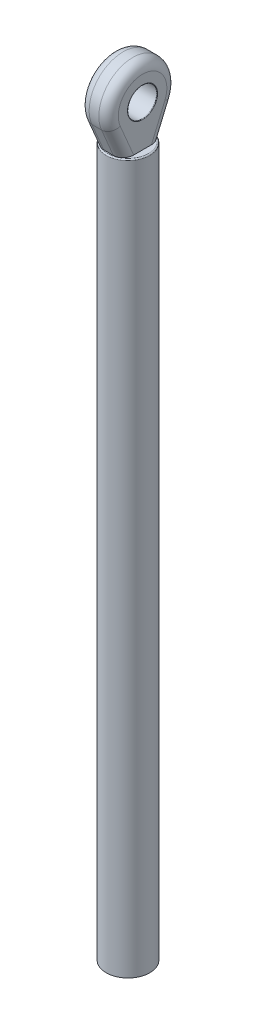
ISO-10303-21;
HEADER;
FILE_DESCRIPTION(('STEP AP214'),'2;1');
FILE_NAME('part.step','',(''),(''),'','','');
FILE_SCHEMA(('AUTOMOTIVE_DESIGN { 1 0 10303 214 1 1 1 1 }'));
ENDSEC;
DATA;
#1=APPLICATION_CONTEXT('core data for automotive mechanical design processes');
#2=APPLICATION_PROTOCOL_DEFINITION('international standard','automotive_design',2000,#1);
#3=PRODUCT_CONTEXT('',#1,'mechanical');
#4=PRODUCT('Part','Part','',(#3));
#5=PRODUCT_RELATED_PRODUCT_CATEGORY('part','',(#4));
#6=PRODUCT_DEFINITION_FORMATION('','',#4);
#7=PRODUCT_DEFINITION_CONTEXT('part definition',#1,'design');
#8=PRODUCT_DEFINITION('design','',#6,#7);
#9=PRODUCT_DEFINITION_SHAPE('','',#8);
#10=(LENGTH_UNIT() NAMED_UNIT(*) SI_UNIT(.MILLI.,.METRE.));
#11=(NAMED_UNIT(*) PLANE_ANGLE_UNIT() SI_UNIT($,.RADIAN.));
#12=(NAMED_UNIT(*) SI_UNIT($,.STERADIAN.) SOLID_ANGLE_UNIT());
#13=UNCERTAINTY_MEASURE_WITH_UNIT(LENGTH_MEASURE(1.E-05),#10,'distance_accuracy_value','');
#14=(GEOMETRIC_REPRESENTATION_CONTEXT(3) GLOBAL_UNCERTAINTY_ASSIGNED_CONTEXT((#13)) GLOBAL_UNIT_ASSIGNED_CONTEXT((#10,
#11,#12)) REPRESENTATION_CONTEXT('',''));
#15=CARTESIAN_POINT('',(0.,0.,0.));
#16=DIRECTION('',(0.,0.,1.));
#17=DIRECTION('',(1.,0.,0.));
#18=AXIS2_PLACEMENT_3D('',#15,#16,#17);
#19=CARTESIAN_POINT('',(0.,0.,0.));
#20=DIRECTION('',(0.,1.,0.));
#21=DIRECTION('',(0.,0.,1.));
#22=AXIS2_PLACEMENT_3D('',#19,#20,#21);
#23=PLANE('',#22);
#24=CARTESIAN_POINT('',(0.,0.,0.));
#25=DIRECTION('',(0.,1.,0.));
#26=DIRECTION('',(0.,0.,1.));
#27=AXIS2_PLACEMENT_3D('',#24,#25,#26);
#28=CIRCLE('',#27,45.);
#29=CARTESIAN_POINT('',(0.,0.,45.));
#30=VERTEX_POINT('',#29);
#31=EDGE_CURVE('E348',#30,#30,#28,.T.);
#32=ORIENTED_EDGE('',*,*,#31,.F.);
#33=EDGE_LOOP('',(#32));
#34=FACE_BOUND('',#33,.T.);
#35=CARTESIAN_POINT('',(0.,0.,0.));
#36=DIRECTION('',(0.,1.,0.));
#37=DIRECTION('',(0.,0.,1.));
#38=AXIS2_PLACEMENT_3D('',#35,#36,#37);
#39=CIRCLE('',#38,22.5);
#40=CARTESIAN_POINT('',(0.,0.,22.5));
#41=VERTEX_POINT('',#40);
#42=EDGE_CURVE('E347',#41,#41,#39,.T.);
#43=ORIENTED_EDGE('',*,*,#42,.T.);
#44=EDGE_LOOP('',(#43));
#45=FACE_BOUND('',#44,.T.);
#46=ADVANCED_FACE('F34',(#34,#45),#23,.F.);
#47=CARTESIAN_POINT('',(0.,1450.,0.));
#48=DIRECTION('',(0.,-1.,0.));
#49=DIRECTION('',(0.,0.,-1.));
#50=AXIS2_PLACEMENT_3D('',#47,#48,#49);
#51=CYLINDRICAL_SURFACE('',#50,45.);
#52=CARTESIAN_POINT('',(0.,1457.5,0.));
#53=DIRECTION('',(0.,-1.,0.));
#54=DIRECTION('',(0.,0.,-1.));
#55=AXIS2_PLACEMENT_3D('',#52,#53,#54);
#56=CIRCLE('',#55,45.);
#57=CARTESIAN_POINT('',(0.,1457.5,-45.));
#58=VERTEX_POINT('',#57);
#59=EDGE_CURVE('E130',#58,#58,#56,.T.);
#60=ORIENTED_EDGE('',*,*,#59,.T.);
#61=EDGE_LOOP('',(#60));
#62=FACE_BOUND('',#61,.T.);
#63=ORIENTED_EDGE('',*,*,#31,.T.);
#64=EDGE_LOOP('',(#63));
#65=FACE_BOUND('',#64,.T.);
#66=ADVANCED_FACE('F163',(#62,#65),#51,.T.);
#67=CARTESIAN_POINT('',(0.,1450.,0.));
#68=DIRECTION('',(0.,-1.,0.));
#69=DIRECTION('',(0.,0.,-1.));
#70=AXIS2_PLACEMENT_3D('',#67,#68,#69);
#71=CYLINDRICAL_SURFACE('',#70,22.5);
#72=CARTESIAN_POINT('',(0.,1450.,0.));
#73=DIRECTION('',(0.,1.,0.));
#74=DIRECTION('',(0.,0.,1.));
#75=AXIS2_PLACEMENT_3D('',#72,#73,#74);
#76=CIRCLE('',#75,22.5);
#77=CARTESIAN_POINT('',(0.,1450.,22.5));
#78=VERTEX_POINT('',#77);
#79=EDGE_CURVE('E344',#78,#78,#76,.T.);
#80=ORIENTED_EDGE('',*,*,#79,.T.);
#81=EDGE_LOOP('',(#80));
#82=FACE_BOUND('',#81,.T.);
#83=ORIENTED_EDGE('',*,*,#42,.F.);
#84=EDGE_LOOP('',(#83));
#85=FACE_BOUND('',#84,.T.);
#86=ADVANCED_FACE('F169',(#82,#85),#71,.F.);
#87=CARTESIAN_POINT('',(0.,1450.,0.));
#88=DIRECTION('',(0.,1.,0.));
#89=DIRECTION('',(0.,0.,1.));
#90=AXIS2_PLACEMENT_3D('',#87,#88,#89);
#91=PLANE('',#90);
#92=ORIENTED_EDGE('',*,*,#79,.F.);
#93=EDGE_LOOP('',(#92));
#94=FACE_BOUND('',#93,.T.);
#95=ADVANCED_FACE('F309',(#94),#91,.F.);
#96=CARTESIAN_POINT('',(-30.,1660.,-75.0000000000001));
#97=DIRECTION('',(1.,0.,0.));
#98=DIRECTION('',(0.,0.,-1.));
#99=AXIS2_PLACEMENT_3D('',#96,#97,#98);
#100=PLANE('',#99);
#101=DIRECTION('',(0.,0.,1.));
#102=VECTOR('',#101,1.);
#103=CARTESIAN_POINT('',(-30.,1460.,-75.0000000000001));
#104=LINE('',#103,#102);
#105=CARTESIAN_POINT('',(-30.,1460.,-18.2775506528153));
#106=VERTEX_POINT('',#105);
#107=CARTESIAN_POINT('',(-30.,1460.,18.2775506528153));
#108=VERTEX_POINT('',#107);
#109=EDGE_CURVE('E110',#106,#108,#104,.T.);
#110=ORIENTED_EDGE('',*,*,#109,.T.);
#111=DIRECTION('',(0.,0.920706485734868,0.390255771418886));
#112=VECTOR('',#111,1.);
#113=CARTESIAN_POINT('',(-30.,1596.02443472153,75.9336240340078));
#114=LINE('',#113,#112);
#115=CARTESIAN_POINT('',(-30.,1525.48721142906,46.0353242867434));
#116=VERTEX_POINT('',#115);
#117=EDGE_CURVE('E116',#108,#116,#114,.T.);
#118=ORIENTED_EDGE('',*,*,#117,.T.);
#119=CARTESIAN_POINT('',(-30.,1545.,0.));
#120=DIRECTION('',(1.,0.,0.));
#121=DIRECTION('',(0.,0.,-1.));
#122=AXIS2_PLACEMENT_3D('',#119,#120,#121);
#123=CIRCLE('',#122,50.);
#124=CARTESIAN_POINT('',(-30.,1525.48721142906,-46.0353242867434));
#125=VERTEX_POINT('',#124);
#126=EDGE_CURVE('E51',#116,#125,#123,.F.);
#127=ORIENTED_EDGE('',*,*,#126,.T.);
#128=DIRECTION('',(0.,-0.920706485734868,0.390255771418886));
#129=VECTOR('',#128,1.);
#130=CARTESIAN_POINT('',(-30.,1649.92108769766,-98.7785591028703));
#131=LINE('',#130,#129);
#132=EDGE_CURVE('E107',#125,#106,#131,.T.);
#133=ORIENTED_EDGE('',*,*,#132,.T.);
#134=EDGE_LOOP('',(#110,#118,#127,#133));
#135=FACE_BOUND('',#134,.T.);
#136=CARTESIAN_POINT('',(-30.,1545.,0.));
#137=DIRECTION('',(1.,0.,0.));
#138=DIRECTION('',(0.,0.,-1.));
#139=AXIS2_PLACEMENT_3D('',#136,#137,#138);
#140=CIRCLE('',#139,30.);
#141=CARTESIAN_POINT('',(-30.,1545.,-30.));
#142=VERTEX_POINT('',#141);
#143=EDGE_CURVE('E142',#142,#142,#140,.T.);
#144=ORIENTED_EDGE('',*,*,#143,.T.);
#145=EDGE_LOOP('',(#144));
#146=FACE_BOUND('',#145,.T.);
#147=ADVANCED_FACE('F108',(#135,#146),#100,.F.);
#148=CARTESIAN_POINT('',(30.,1660.,-75.0000000000001));
#149=DIRECTION('',(-1.,0.,0.));
#150=DIRECTION('',(0.,0.,1.));
#151=AXIS2_PLACEMENT_3D('',#148,#149,#150);
#152=PLANE('',#151);
#153=CARTESIAN_POINT('',(30.,1545.,0.));
#154=DIRECTION('',(-1.,0.,0.));
#155=DIRECTION('',(0.,0.,1.));
#156=AXIS2_PLACEMENT_3D('',#153,#154,#155);
#157=CIRCLE('',#156,31.);
#158=CARTESIAN_POINT('',(30.,1545.,31.));
#159=VERTEX_POINT('',#158);
#160=EDGE_CURVE('E11',#159,#159,#157,.T.);
#161=ORIENTED_EDGE('',*,*,#160,.T.);
#162=EDGE_LOOP('',(#161));
#163=FACE_BOUND('',#162,.T.);
#164=CARTESIAN_POINT('',(30.,1545.,0.));
#165=DIRECTION('',(-1.,0.,0.));
#166=DIRECTION('',(0.,0.,1.));
#167=AXIS2_PLACEMENT_3D('',#164,#165,#166);
#168=CIRCLE('',#167,50.);
#169=CARTESIAN_POINT('',(30.,1525.48721142906,-46.0353242867434));
#170=VERTEX_POINT('',#169);
#171=CARTESIAN_POINT('',(30.,1525.48721142906,46.0353242867434));
#172=VERTEX_POINT('',#171);
#173=EDGE_CURVE('E360',#170,#172,#168,.F.);
#174=ORIENTED_EDGE('',*,*,#173,.T.);
#175=DIRECTION('',(0.,0.920706485734868,0.390255771418886));
#176=VECTOR('',#175,1.);
#177=CARTESIAN_POINT('',(30.,1596.02443472153,75.9336240340078));
#178=LINE('',#177,#176);
#179=CARTESIAN_POINT('',(30.,1460.,18.2775506528153));
#180=VERTEX_POINT('',#179);
#181=EDGE_CURVE('E364',#172,#180,#178,.F.);
#182=ORIENTED_EDGE('',*,*,#181,.T.);
#183=DIRECTION('',(0.,0.,-1.));
#184=VECTOR('',#183,1.);
#185=CARTESIAN_POINT('',(30.,1460.,-75.0000000000001));
#186=LINE('',#185,#184);
#187=CARTESIAN_POINT('',(30.,1460.,-18.2775506528153));
#188=VERTEX_POINT('',#187);
#189=EDGE_CURVE('E122',#180,#188,#186,.T.);
#190=ORIENTED_EDGE('',*,*,#189,.T.);
#191=DIRECTION('',(0.,-0.920706485734868,0.390255771418886));
#192=VECTOR('',#191,1.);
#193=CARTESIAN_POINT('',(30.,1649.92108769766,-98.7785591028704));
#194=LINE('',#193,#192);
#195=EDGE_CURVE('E362',#188,#170,#194,.F.);
#196=ORIENTED_EDGE('',*,*,#195,.T.);
#197=EDGE_LOOP('',(#174,#182,#190,#196));
#198=FACE_BOUND('',#197,.T.);
#199=ADVANCED_FACE('F224',(#163,#198),#152,.F.);
#200=CARTESIAN_POINT('',(-45.,1545.,0.));
#201=DIRECTION('',(1.,0.,0.));
#202=DIRECTION('',(0.,0.,-1.));
#203=AXIS2_PLACEMENT_3D('',#200,#201,#202);
#204=CYLINDRICAL_SURFACE('',#203,70.);
#205=DIRECTION('',(1.,0.,0.));
#206=VECTOR('',#205,1.);
#207=CARTESIAN_POINT('',(-45.,1517.68209600068,64.4494540014407));
#208=LINE('',#207,#206);
#209=CARTESIAN_POINT('',(-9.99999999999999,1517.68209600068,64.4494540014407));
#210=VERTEX_POINT('',#209);
#211=CARTESIAN_POINT('',(10.,1517.68209600068,64.4494540014407));
#212=VERTEX_POINT('',#211);
#213=EDGE_CURVE('E352',#210,#212,#208,.T.);
#214=ORIENTED_EDGE('',*,*,#213,.T.);
#215=CARTESIAN_POINT('',(10.,1545.,0.));
#216=DIRECTION('',(-1.,0.,0.));
#217=DIRECTION('',(0.,0.,1.));
#218=AXIS2_PLACEMENT_3D('',#215,#216,#217);
#219=CIRCLE('',#218,70.);
#220=CARTESIAN_POINT('',(9.99999999999999,1517.68209600068,-64.4494540014407));
#221=VERTEX_POINT('',#220);
#222=EDGE_CURVE('E373',#212,#221,#219,.T.);
#223=ORIENTED_EDGE('',*,*,#222,.T.);
#224=DIRECTION('',(1.,0.,0.));
#225=VECTOR('',#224,1.);
#226=CARTESIAN_POINT('',(-45.,1517.68209600068,-64.4494540014407));
#227=LINE('',#226,#225);
#228=CARTESIAN_POINT('',(-9.99999999999999,1517.68209600068,-64.4494540014407));
#229=VERTEX_POINT('',#228);
#230=EDGE_CURVE('E397',#229,#221,#227,.T.);
#231=ORIENTED_EDGE('',*,*,#230,.F.);
#232=CARTESIAN_POINT('',(-9.99999999999999,1545.,0.));
#233=DIRECTION('',(1.,0.,0.));
#234=DIRECTION('',(0.,0.,-1.));
#235=AXIS2_PLACEMENT_3D('',#232,#233,#234);
#236=CIRCLE('',#235,70.);
#237=EDGE_CURVE('E371',#229,#210,#236,.T.);
#238=ORIENTED_EDGE('',*,*,#237,.T.);
#239=EDGE_LOOP('',(#214,#223,#231,#238));
#240=FACE_BOUND('',#239,.T.);
#241=ADVANCED_FACE('F229',(#240),#204,.T.);
#242=CARTESIAN_POINT('',(-45.,1460.,40.));
#243=DIRECTION('',(0.,0.390255771418886,-0.920706485734868));
#244=DIRECTION('',(0.,0.920706485734868,0.390255771418886));
#245=AXIS2_PLACEMENT_3D('',#242,#243,#244);
#246=PLANE('',#245);
#247=DIRECTION('',(1.,0.,0.));
#248=VECTOR('',#247,1.);
#249=CARTESIAN_POINT('',(-45.,1460.,40.));
#250=LINE('',#249,#248);
#251=CARTESIAN_POINT('',(-9.99999999999999,1460.,40.));
#252=VERTEX_POINT('',#251);
#253=CARTESIAN_POINT('',(9.99999999999999,1460.,40.));
#254=VERTEX_POINT('',#253);
#255=EDGE_CURVE('E388',#252,#254,#250,.T.);
#256=ORIENTED_EDGE('',*,*,#255,.T.);
#257=DIRECTION('',(0.,0.920706485734868,0.390255771418886));
#258=VECTOR('',#257,1.);
#259=CARTESIAN_POINT('',(9.99999999999999,1460.,40.));
#260=LINE('',#259,#258);
#261=EDGE_CURVE('E357',#254,#212,#260,.T.);
#262=ORIENTED_EDGE('',*,*,#261,.T.);
#263=ORIENTED_EDGE('',*,*,#213,.F.);
#264=DIRECTION('',(0.,0.920706485734868,0.390255771418886));
#265=VECTOR('',#264,1.);
#266=CARTESIAN_POINT('',(-9.99999999999999,1460.,40.));
#267=LINE('',#266,#265);
#268=EDGE_CURVE('E73',#210,#252,#267,.F.);
#269=ORIENTED_EDGE('',*,*,#268,.T.);
#270=EDGE_LOOP('',(#256,#262,#263,#269));
#271=FACE_BOUND('',#270,.T.);
#272=ADVANCED_FACE('F289',(#271),#246,.F.);
#273=CARTESIAN_POINT('',(-45.,1460.,-40.));
#274=DIRECTION('',(0.,0.390255771418886,0.920706485734868));
#275=DIRECTION('',(0.,-0.920706485734868,0.390255771418886));
#276=AXIS2_PLACEMENT_3D('',#273,#274,#275);
#277=PLANE('',#276);
#278=ORIENTED_EDGE('',*,*,#230,.T.);
#279=DIRECTION('',(0.,-0.920706485734868,0.390255771418886));
#280=VECTOR('',#279,1.);
#281=CARTESIAN_POINT('',(9.99999999999999,1460.,-40.));
#282=LINE('',#281,#280);
#283=CARTESIAN_POINT('',(9.99999999999999,1460.,-40.));
#284=VERTEX_POINT('',#283);
#285=EDGE_CURVE('E367',#221,#284,#282,.T.);
#286=ORIENTED_EDGE('',*,*,#285,.T.);
#287=DIRECTION('',(1.,0.,0.));
#288=VECTOR('',#287,1.);
#289=CARTESIAN_POINT('',(-45.,1460.,-40.));
#290=LINE('',#289,#288);
#291=CARTESIAN_POINT('',(-9.99999999999999,1460.,-40.));
#292=VERTEX_POINT('',#291);
#293=EDGE_CURVE('E377',#292,#284,#290,.T.);
#294=ORIENTED_EDGE('',*,*,#293,.F.);
#295=DIRECTION('',(0.,-0.920706485734868,0.390255771418886));
#296=VECTOR('',#295,1.);
#297=CARTESIAN_POINT('',(-9.99999999999999,1460.,-40.));
#298=LINE('',#297,#296);
#299=EDGE_CURVE('E126',#292,#229,#298,.F.);
#300=ORIENTED_EDGE('',*,*,#299,.T.);
#301=EDGE_LOOP('',(#278,#286,#294,#300));
#302=FACE_BOUND('',#301,.T.);
#303=ADVANCED_FACE('F278',(#302),#277,.F.);
#304=CARTESIAN_POINT('',(-45.,1460.,-75.0000000000001));
#305=DIRECTION('',(0.,-1.,0.));
#306=DIRECTION('',(0.,0.,-1.));
#307=AXIS2_PLACEMENT_3D('',#304,#305,#306);
#308=PLANE('',#307);
#309=CARTESIAN_POINT('',(0.,1460.,0.));
#310=DIRECTION('',(0.,-1.,0.));
#311=DIRECTION('',(0.,0.,-1.));
#312=AXIS2_PLACEMENT_3D('',#309,#310,#311);
#313=CIRCLE('',#312,42.5);
#314=CARTESIAN_POINT('',(0.,1460.,-42.5));
#315=VERTEX_POINT('',#314);
#316=EDGE_CURVE('E127',#315,#315,#313,.F.);
#317=ORIENTED_EDGE('',*,*,#316,.T.);
#318=EDGE_LOOP('',(#317));
#319=FACE_BOUND('',#318,.T.);
#320=ORIENTED_EDGE('',*,*,#109,.F.);
#321=CARTESIAN_POINT('',(-9.99999999999999,1460.,-18.2775506528153));
#322=DIRECTION('',(0.,-1.,0.));
#323=DIRECTION('',(0.,0.,1.));
#324=AXIS2_PLACEMENT_3D('',#321,#322,#323);
#325=ELLIPSE('',#324,21.7224493471846,20.);
#326=EDGE_CURVE('E120',#106,#292,#325,.T.);
#327=ORIENTED_EDGE('',*,*,#326,.T.);
#328=ORIENTED_EDGE('',*,*,#293,.T.);
#329=CARTESIAN_POINT('',(9.99999999999999,1460.,-18.2775506528154));
#330=DIRECTION('',(0.,1.,0.));
#331=DIRECTION('',(0.,0.,1.));
#332=AXIS2_PLACEMENT_3D('',#329,#330,#331);
#333=ELLIPSE('',#332,21.7224493471846,20.);
#334=EDGE_CURVE('E132',#284,#188,#333,.F.);
#335=ORIENTED_EDGE('',*,*,#334,.T.);
#336=ORIENTED_EDGE('',*,*,#189,.F.);
#337=CARTESIAN_POINT('',(9.99999999999999,1460.,18.2775506528154));
#338=DIRECTION('',(0.,-1.,0.));
#339=DIRECTION('',(0.,0.,1.));
#340=AXIS2_PLACEMENT_3D('',#337,#338,#339);
#341=ELLIPSE('',#340,21.7224493471846,20.);
#342=EDGE_CURVE('E81',#180,#254,#341,.T.);
#343=ORIENTED_EDGE('',*,*,#342,.T.);
#344=ORIENTED_EDGE('',*,*,#255,.F.);
#345=CARTESIAN_POINT('',(-9.99999999999999,1460.,18.2775506528153));
#346=DIRECTION('',(0.,1.,0.));
#347=DIRECTION('',(0.,0.,1.));
#348=AXIS2_PLACEMENT_3D('',#345,#346,#347);
#349=ELLIPSE('',#348,21.7224493471846,20.);
#350=EDGE_CURVE('E105',#252,#108,#349,.F.);
#351=ORIENTED_EDGE('',*,*,#350,.T.);
#352=EDGE_LOOP('',(#320,#327,#328,#335,#336,#343,#344,#351));
#353=FACE_BOUND('',#352,.T.);
#354=ADVANCED_FACE('F118',(#319,#353),#308,.F.);
#355=CARTESIAN_POINT('',(-45.,1545.,0.));
#356=DIRECTION('',(1.,0.,0.));
#357=DIRECTION('',(0.,0.,-1.));
#358=AXIS2_PLACEMENT_3D('',#355,#356,#357);
#359=CYLINDRICAL_SURFACE('',#358,30.);
#360=CARTESIAN_POINT('',(29.,1545.,0.));
#361=DIRECTION('',(-1.,0.,0.));
#362=DIRECTION('',(0.,0.,1.));
#363=AXIS2_PLACEMENT_3D('',#360,#361,#362);
#364=CIRCLE('',#363,30.);
#365=CARTESIAN_POINT('',(29.,1545.,30.));
#366=VERTEX_POINT('',#365);
#367=EDGE_CURVE('E43',#366,#366,#364,.F.);
#368=ORIENTED_EDGE('',*,*,#367,.T.);
#369=EDGE_LOOP('',(#368));
#370=FACE_BOUND('',#369,.T.);
#371=ORIENTED_EDGE('',*,*,#143,.F.);
#372=EDGE_LOOP('',(#371));
#373=FACE_BOUND('',#372,.T.);
#374=ADVANCED_FACE('F150',(#370,#373),#359,.F.);
#375=CARTESIAN_POINT('',(9.99999999999999,1467.80511542838,-21.5858702853026));
#376=DIRECTION('',(0.,-0.920706485734868,0.390255771418886));
#377=DIRECTION('',(0.,-0.390255771418886,-0.920706485734868));
#378=AXIS2_PLACEMENT_3D('',#375,#376,#377);
#379=CYLINDRICAL_SURFACE('',#378,20.);
#380=ORIENTED_EDGE('',*,*,#334,.F.);
#381=ORIENTED_EDGE('',*,*,#285,.F.);
#382=CARTESIAN_POINT('',(9.99999999999999,1525.48721142906,-46.0353242867434));
#383=DIRECTION('',(0.,0.920706485734866,-0.390255771418889));
#384=DIRECTION('',(0.,0.390255771418889,0.920706485734866));
#385=AXIS2_PLACEMENT_3D('',#382,#383,#384);
#386=CIRCLE('',#385,20.);
#387=EDGE_CURVE('E138',#170,#221,#386,.T.);
#388=ORIENTED_EDGE('',*,*,#387,.F.);
#389=ORIENTED_EDGE('',*,*,#195,.F.);
#390=EDGE_LOOP('',(#380,#381,#388,#389));
#391=FACE_BOUND('',#390,.T.);
#392=ADVANCED_FACE('F184',(#391),#379,.T.);
#393=CARTESIAN_POINT('',(9.99999999999999,1545.,0.));
#394=DIRECTION('',(-1.,0.,0.));
#395=DIRECTION('',(0.,0.,1.));
#396=AXIS2_PLACEMENT_3D('',#393,#394,#395);
#397=TOROIDAL_SURFACE('',#396,50.,20.);
#398=ORIENTED_EDGE('',*,*,#387,.T.);
#399=ORIENTED_EDGE('',*,*,#222,.F.);
#400=CARTESIAN_POINT('',(9.99999999999999,1525.48721142906,46.0353242867434));
#401=DIRECTION('',(0.,-0.920706485734866,-0.39025577141889));
#402=DIRECTION('',(0.,0.39025577141889,-0.920706485734866));
#403=AXIS2_PLACEMENT_3D('',#400,#401,#402);
#404=CIRCLE('',#403,20.);
#405=EDGE_CURVE('E136',#172,#212,#404,.T.);
#406=ORIENTED_EDGE('',*,*,#405,.F.);
#407=ORIENTED_EDGE('',*,*,#173,.F.);
#408=EDGE_LOOP('',(#398,#399,#406,#407));
#409=FACE_BOUND('',#408,.T.);
#410=ADVANCED_FACE('F180',(#409),#397,.T.);
#411=CARTESIAN_POINT('',(9.99999999999999,1467.80511542838,21.5858702853027));
#412=DIRECTION('',(0.,0.920706485734868,0.390255771418886));
#413=DIRECTION('',(0.,-0.390255771418886,0.920706485734868));
#414=AXIS2_PLACEMENT_3D('',#411,#412,#413);
#415=CYLINDRICAL_SURFACE('',#414,20.);
#416=ORIENTED_EDGE('',*,*,#342,.F.);
#417=ORIENTED_EDGE('',*,*,#181,.F.);
#418=ORIENTED_EDGE('',*,*,#405,.T.);
#419=ORIENTED_EDGE('',*,*,#261,.F.);
#420=EDGE_LOOP('',(#416,#417,#418,#419));
#421=FACE_BOUND('',#420,.T.);
#422=ADVANCED_FACE('F177',(#421),#415,.T.);
#423=CARTESIAN_POINT('',(-9.99999999999999,1649.92108769766,-98.7785591028704));
#424=DIRECTION('',(0.,-0.920706485734868,0.390255771418886));
#425=DIRECTION('',(0.,-0.390255771418886,-0.920706485734868));
#426=AXIS2_PLACEMENT_3D('',#423,#424,#425);
#427=CYLINDRICAL_SURFACE('',#426,20.);
#428=ORIENTED_EDGE('',*,*,#326,.F.);
#429=ORIENTED_EDGE('',*,*,#132,.F.);
#430=CARTESIAN_POINT('',(-9.99999999999999,1525.48721142906,-46.0353242867434));
#431=DIRECTION('',(0.,0.920706485734866,-0.39025577141889));
#432=DIRECTION('',(0.,0.39025577141889,0.920706485734866));
#433=AXIS2_PLACEMENT_3D('',#430,#431,#432);
#434=CIRCLE('',#433,20.);
#435=EDGE_CURVE('E139',#229,#125,#434,.T.);
#436=ORIENTED_EDGE('',*,*,#435,.F.);
#437=ORIENTED_EDGE('',*,*,#299,.F.);
#438=EDGE_LOOP('',(#428,#429,#436,#437));
#439=FACE_BOUND('',#438,.T.);
#440=ADVANCED_FACE('F125',(#439),#427,.T.);
#441=CARTESIAN_POINT('',(-9.99999999999999,1545.,0.));
#442=DIRECTION('',(1.,0.,0.));
#443=DIRECTION('',(0.,0.,-1.));
#444=AXIS2_PLACEMENT_3D('',#441,#442,#443);
#445=TOROIDAL_SURFACE('',#444,50.,20.);
#446=ORIENTED_EDGE('',*,*,#435,.T.);
#447=ORIENTED_EDGE('',*,*,#126,.F.);
#448=CARTESIAN_POINT('',(-10.,1525.48721142906,46.0353242867434));
#449=DIRECTION('',(0.,-0.920706485734866,-0.39025577141889));
#450=DIRECTION('',(0.,0.39025577141889,-0.920706485734866));
#451=AXIS2_PLACEMENT_3D('',#448,#449,#450);
#452=CIRCLE('',#451,20.);
#453=EDGE_CURVE('E143',#210,#116,#452,.T.);
#454=ORIENTED_EDGE('',*,*,#453,.F.);
#455=ORIENTED_EDGE('',*,*,#237,.F.);
#456=EDGE_LOOP('',(#446,#447,#454,#455));
#457=FACE_BOUND('',#456,.T.);
#458=ADVANCED_FACE('F191',(#457),#445,.T.);
#459=CARTESIAN_POINT('',(-10.,1596.02443472153,75.9336240340079));
#460=DIRECTION('',(0.,0.920706485734868,0.390255771418886));
#461=DIRECTION('',(0.,-0.390255771418886,0.920706485734868));
#462=AXIS2_PLACEMENT_3D('',#459,#460,#461);
#463=CYLINDRICAL_SURFACE('',#462,20.);
#464=ORIENTED_EDGE('',*,*,#350,.F.);
#465=ORIENTED_EDGE('',*,*,#268,.F.);
#466=ORIENTED_EDGE('',*,*,#453,.T.);
#467=ORIENTED_EDGE('',*,*,#117,.F.);
#468=EDGE_LOOP('',(#464,#465,#466,#467));
#469=FACE_BOUND('',#468,.T.);
#470=ADVANCED_FACE('F159',(#469),#463,.T.);
#471=CARTESIAN_POINT('',(0.,1457.5,0.));
#472=DIRECTION('',(0.,-1.,0.));
#473=DIRECTION('',(0.,0.,-1.));
#474=AXIS2_PLACEMENT_3D('',#471,#472,#473);
#475=TOROIDAL_SURFACE('',#474,42.5,2.5);
#476=ORIENTED_EDGE('',*,*,#59,.F.);
#477=EDGE_LOOP('',(#476));
#478=FACE_BOUND('',#477,.T.);
#479=ORIENTED_EDGE('',*,*,#316,.F.);
#480=EDGE_LOOP('',(#479));
#481=FACE_BOUND('',#480,.T.);
#482=ADVANCED_FACE('F154',(#478,#481),#475,.T.);
#483=CARTESIAN_POINT('',(29.,1545.,0.));
#484=DIRECTION('',(-1.,0.,0.));
#485=DIRECTION('',(0.,0.,1.));
#486=AXIS2_PLACEMENT_3D('',#483,#484,#485);
#487=TOROIDAL_SURFACE('',#486,31.,1.);
#488=ORIENTED_EDGE('',*,*,#160,.F.);
#489=EDGE_LOOP('',(#488));
#490=FACE_BOUND('',#489,.T.);
#491=ORIENTED_EDGE('',*,*,#367,.F.);
#492=EDGE_LOOP('',(#491));
#493=FACE_BOUND('',#492,.T.);
#494=ADVANCED_FACE('F36',(#490,#493),#487,.T.);
#495=CLOSED_SHELL('',(#46,#66,#86,#95,#147,#199,#241,#272,#303,#354,#374,#392,#410,#422,#440,
#458,#470,#482,#494));
#496=MANIFOLD_SOLID_BREP('B2',#495);
#497=ADVANCED_BREP_SHAPE_REPRESENTATION('',(#18,#496),#14);
#498=SHAPE_DEFINITION_REPRESENTATION(#9,#497);
ENDSEC;
END-ISO-10303-21;
